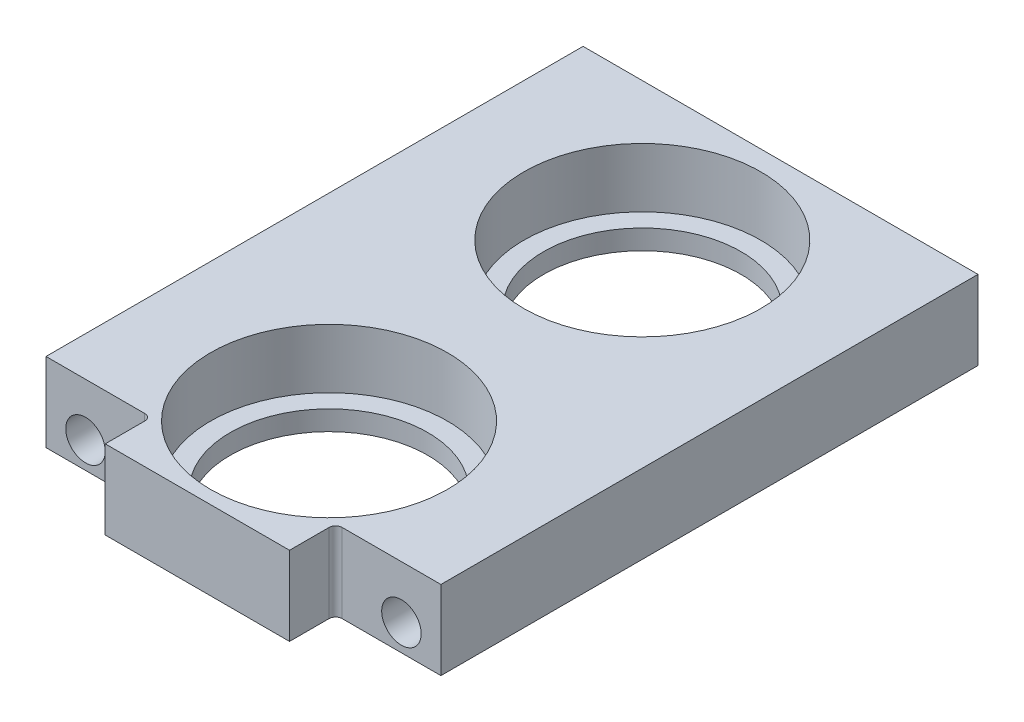
ISO-10303-21;
HEADER;
FILE_DESCRIPTION(('STEP AP214'),'2;1');
FILE_NAME('part.step','',(''),(''),'','','');
FILE_SCHEMA(('AUTOMOTIVE_DESIGN { 1 0 10303 214 1 1 1 1 }'));
ENDSEC;
DATA;
#1=APPLICATION_CONTEXT('core data for automotive mechanical design processes');
#2=APPLICATION_PROTOCOL_DEFINITION('international standard','automotive_design',2000,#1);
#3=PRODUCT_CONTEXT('',#1,'mechanical');
#4=PRODUCT('Part','Part','',(#3));
#5=PRODUCT_RELATED_PRODUCT_CATEGORY('part','',(#4));
#6=PRODUCT_DEFINITION_FORMATION('','',#4);
#7=PRODUCT_DEFINITION_CONTEXT('part definition',#1,'design');
#8=PRODUCT_DEFINITION('design','',#6,#7);
#9=PRODUCT_DEFINITION_SHAPE('','',#8);
#10=(LENGTH_UNIT() NAMED_UNIT(*) SI_UNIT(.MILLI.,.METRE.));
#11=(NAMED_UNIT(*) PLANE_ANGLE_UNIT() SI_UNIT($,.RADIAN.));
#12=(NAMED_UNIT(*) SI_UNIT($,.STERADIAN.) SOLID_ANGLE_UNIT());
#13=UNCERTAINTY_MEASURE_WITH_UNIT(LENGTH_MEASURE(1.E-05),#10,'distance_accuracy_value','');
#14=(GEOMETRIC_REPRESENTATION_CONTEXT(3) GLOBAL_UNCERTAINTY_ASSIGNED_CONTEXT((#13)) GLOBAL_UNIT_ASSIGNED_CONTEXT((#10,
#11,#12)) REPRESENTATION_CONTEXT('',''));
#15=CARTESIAN_POINT('',(0.,0.,0.));
#16=DIRECTION('',(0.,0.,1.));
#17=DIRECTION('',(1.,0.,0.));
#18=AXIS2_PLACEMENT_3D('',#15,#16,#17);
#19=CARTESIAN_POINT('',(15.,6.,-22.15));
#20=DIRECTION('',(-1.,0.,0.));
#21=DIRECTION('',(0.,0.,1.));
#22=AXIS2_PLACEMENT_3D('',#19,#20,#21);
#23=PLANE('',#22);
#24=DIRECTION('',(0.,0.,-1.));
#25=VECTOR('',#24,1.);
#26=CARTESIAN_POINT('',(15.,6.,-22.15));
#27=LINE('',#26,#25);
#28=CARTESIAN_POINT('',(15.,6.,18.65));
#29=VERTEX_POINT('',#28);
#30=CARTESIAN_POINT('',(15.,6.,-22.15));
#31=VERTEX_POINT('',#30);
#32=EDGE_CURVE('E156',#29,#31,#27,.T.);
#33=ORIENTED_EDGE('',*,*,#32,.F.);
#34=DIRECTION('',(0.,1.,0.));
#35=VECTOR('',#34,1.);
#36=CARTESIAN_POINT('',(15.,-4.,18.65));
#37=LINE('',#36,#35);
#38=CARTESIAN_POINT('',(15.,0.,18.65));
#39=VERTEX_POINT('',#38);
#40=EDGE_CURVE('E300',#39,#29,#37,.T.);
#41=ORIENTED_EDGE('',*,*,#40,.F.);
#42=DIRECTION('',(0.,0.,-1.));
#43=VECTOR('',#42,1.);
#44=CARTESIAN_POINT('',(15.,0.,-22.15));
#45=LINE('',#44,#43);
#46=CARTESIAN_POINT('',(15.,0.,-22.15));
#47=VERTEX_POINT('',#46);
#48=EDGE_CURVE('E147',#39,#47,#45,.T.);
#49=ORIENTED_EDGE('',*,*,#48,.T.);
#50=DIRECTION('',(0.,-1.,0.));
#51=VECTOR('',#50,1.);
#52=CARTESIAN_POINT('',(15.,6.,-22.15));
#53=LINE('',#52,#51);
#54=EDGE_CURVE('E140',#31,#47,#53,.T.);
#55=ORIENTED_EDGE('',*,*,#54,.F.);
#56=EDGE_LOOP('',(#33,#41,#49,#55));
#57=FACE_BOUND('',#56,.T.);
#58=ADVANCED_FACE('F35',(#57),#23,.F.);
#59=CARTESIAN_POINT('',(-15.,6.,-22.15));
#60=DIRECTION('',(0.,0.,1.));
#61=DIRECTION('',(1.,0.,0.));
#62=AXIS2_PLACEMENT_3D('',#59,#60,#61);
#63=PLANE('',#62);
#64=DIRECTION('',(-1.,0.,0.));
#65=VECTOR('',#64,1.);
#66=CARTESIAN_POINT('',(-15.,0.,-22.15));
#67=LINE('',#66,#65);
#68=CARTESIAN_POINT('',(-15.,0.,-22.15));
#69=VERTEX_POINT('',#68);
#70=EDGE_CURVE('E149',#47,#69,#67,.T.);
#71=ORIENTED_EDGE('',*,*,#70,.T.);
#72=DIRECTION('',(0.,-1.,0.));
#73=VECTOR('',#72,1.);
#74=CARTESIAN_POINT('',(-15.,6.,-22.15));
#75=LINE('',#74,#73);
#76=CARTESIAN_POINT('',(-15.,6.,-22.15));
#77=VERTEX_POINT('',#76);
#78=EDGE_CURVE('E136',#77,#69,#75,.T.);
#79=ORIENTED_EDGE('',*,*,#78,.F.);
#80=DIRECTION('',(-1.,0.,0.));
#81=VECTOR('',#80,1.);
#82=CARTESIAN_POINT('',(-15.,6.,-22.15));
#83=LINE('',#82,#81);
#84=EDGE_CURVE('E143',#31,#77,#83,.T.);
#85=ORIENTED_EDGE('',*,*,#84,.F.);
#86=ORIENTED_EDGE('',*,*,#54,.T.);
#87=EDGE_LOOP('',(#71,#79,#85,#86));
#88=FACE_BOUND('',#87,.T.);
#89=ADVANCED_FACE('F208',(#88),#63,.F.);
#90=CARTESIAN_POINT('',(-15.,6.,-22.15));
#91=DIRECTION('',(1.,0.,0.));
#92=DIRECTION('',(0.,0.,-1.));
#93=AXIS2_PLACEMENT_3D('',#90,#91,#92);
#94=PLANE('',#93);
#95=DIRECTION('',(0.,0.,1.));
#96=VECTOR('',#95,1.);
#97=CARTESIAN_POINT('',(-15.,0.,-22.15));
#98=LINE('',#97,#96);
#99=CARTESIAN_POINT('',(-15.,0.,18.65));
#100=VERTEX_POINT('',#99);
#101=EDGE_CURVE('E152',#69,#100,#98,.T.);
#102=ORIENTED_EDGE('',*,*,#101,.T.);
#103=DIRECTION('',(0.,1.,0.));
#104=VECTOR('',#103,1.);
#105=CARTESIAN_POINT('',(-15.,-4.,18.65));
#106=LINE('',#105,#104);
#107=CARTESIAN_POINT('',(-15.,6.,18.65));
#108=VERTEX_POINT('',#107);
#109=EDGE_CURVE('E122',#100,#108,#106,.T.);
#110=ORIENTED_EDGE('',*,*,#109,.T.);
#111=DIRECTION('',(0.,0.,1.));
#112=VECTOR('',#111,1.);
#113=CARTESIAN_POINT('',(-15.,6.,-22.15));
#114=LINE('',#113,#112);
#115=EDGE_CURVE('E137',#77,#108,#114,.T.);
#116=ORIENTED_EDGE('',*,*,#115,.F.);
#117=ORIENTED_EDGE('',*,*,#78,.T.);
#118=EDGE_LOOP('',(#102,#110,#116,#117));
#119=FACE_BOUND('',#118,.T.);
#120=ADVANCED_FACE('F213',(#119),#94,.F.);
#121=CARTESIAN_POINT('',(-15.,6.,22.15));
#122=DIRECTION('',(0.,0.,-1.));
#123=DIRECTION('',(-1.,0.,0.));
#124=AXIS2_PLACEMENT_3D('',#121,#122,#123);
#125=PLANE('',#124);
#126=DIRECTION('',(1.,0.,0.));
#127=VECTOR('',#126,1.);
#128=CARTESIAN_POINT('',(-15.,6.,22.15));
#129=LINE('',#128,#127);
#130=CARTESIAN_POINT('',(-7.,6.,22.15));
#131=VERTEX_POINT('',#130);
#132=CARTESIAN_POINT('',(7.,6.,22.15));
#133=VERTEX_POINT('',#132);
#134=EDGE_CURVE('E129',#131,#133,#129,.T.);
#135=ORIENTED_EDGE('',*,*,#134,.F.);
#136=DIRECTION('',(0.,1.,0.));
#137=VECTOR('',#136,1.);
#138=CARTESIAN_POINT('',(-7.,-4.,22.15));
#139=LINE('',#138,#137);
#140=CARTESIAN_POINT('',(-7.,0.,22.15));
#141=VERTEX_POINT('',#140);
#142=EDGE_CURVE('E111',#141,#131,#139,.T.);
#143=ORIENTED_EDGE('',*,*,#142,.F.);
#144=DIRECTION('',(1.,0.,0.));
#145=VECTOR('',#144,1.);
#146=CARTESIAN_POINT('',(-15.,0.,22.15));
#147=LINE('',#146,#145);
#148=CARTESIAN_POINT('',(7.,0.,22.15));
#149=VERTEX_POINT('',#148);
#150=EDGE_CURVE('E155',#141,#149,#147,.T.);
#151=ORIENTED_EDGE('',*,*,#150,.T.);
#152=DIRECTION('',(0.,1.,0.));
#153=VECTOR('',#152,1.);
#154=CARTESIAN_POINT('',(7.,-4.,22.15));
#155=LINE('',#154,#153);
#156=EDGE_CURVE('E131',#149,#133,#155,.T.);
#157=ORIENTED_EDGE('',*,*,#156,.T.);
#158=EDGE_LOOP('',(#135,#143,#151,#157));
#159=FACE_BOUND('',#158,.T.);
#160=ADVANCED_FACE('F134',(#159),#125,.F.);
#161=CARTESIAN_POINT('',(0.,6.,0.));
#162=DIRECTION('',(0.,1.,0.));
#163=DIRECTION('',(0.,0.,1.));
#164=AXIS2_PLACEMENT_3D('',#161,#162,#163);
#165=PLANE('',#164);
#166=DIRECTION('',(-1.,0.,0.));
#167=VECTOR('',#166,1.);
#168=CARTESIAN_POINT('',(-6.99999999999999,6.,18.65));
#169=LINE('',#168,#167);
#170=CARTESIAN_POINT('',(-7.49999999999999,6.,18.65));
#171=VERTEX_POINT('',#170);
#172=EDGE_CURVE('E123',#171,#108,#169,.T.);
#173=ORIENTED_EDGE('',*,*,#172,.F.);
#174=CARTESIAN_POINT('',(-7.49999999999999,6.,19.15));
#175=DIRECTION('',(0.,1.,0.));
#176=DIRECTION('',(0.,0.,1.));
#177=AXIS2_PLACEMENT_3D('',#174,#175,#176);
#178=CIRCLE('',#177,0.5);
#179=CARTESIAN_POINT('',(-6.99999999999999,6.,19.15));
#180=VERTEX_POINT('',#179);
#181=EDGE_CURVE('E130',#171,#180,#178,.F.);
#182=ORIENTED_EDGE('',*,*,#181,.T.);
#183=DIRECTION('',(0.,0.,-1.));
#184=VECTOR('',#183,1.);
#185=CARTESIAN_POINT('',(-7.,6.,22.15));
#186=LINE('',#185,#184);
#187=EDGE_CURVE('E114',#131,#180,#186,.T.);
#188=ORIENTED_EDGE('',*,*,#187,.F.);
#189=ORIENTED_EDGE('',*,*,#134,.T.);
#190=DIRECTION('',(0.,0.,1.));
#191=VECTOR('',#190,1.);
#192=CARTESIAN_POINT('',(7.,6.,22.15));
#193=LINE('',#192,#191);
#194=CARTESIAN_POINT('',(7.,6.,19.15));
#195=VERTEX_POINT('',#194);
#196=EDGE_CURVE('E285',#195,#133,#193,.T.);
#197=ORIENTED_EDGE('',*,*,#196,.F.);
#198=CARTESIAN_POINT('',(7.5,6.,19.15));
#199=DIRECTION('',(0.,1.,0.));
#200=DIRECTION('',(0.,0.,1.));
#201=AXIS2_PLACEMENT_3D('',#198,#199,#200);
#202=CIRCLE('',#201,0.5);
#203=CARTESIAN_POINT('',(7.5,6.,18.65));
#204=VERTEX_POINT('',#203);
#205=EDGE_CURVE('E43',#195,#204,#202,.F.);
#206=ORIENTED_EDGE('',*,*,#205,.T.);
#207=DIRECTION('',(-1.,0.,0.));
#208=VECTOR('',#207,1.);
#209=CARTESIAN_POINT('',(7.,6.,18.65));
#210=LINE('',#209,#208);
#211=EDGE_CURVE('E282',#29,#204,#210,.T.);
#212=ORIENTED_EDGE('',*,*,#211,.F.);
#213=ORIENTED_EDGE('',*,*,#32,.T.);
#214=ORIENTED_EDGE('',*,*,#84,.T.);
#215=ORIENTED_EDGE('',*,*,#115,.T.);
#216=EDGE_LOOP('',(#173,#182,#188,#189,#197,#206,#212,#213,#214,#215));
#217=FACE_BOUND('',#216,.T.);
#218=CARTESIAN_POINT('',(0.,6.,-11.65));
#219=DIRECTION('',(0.,1.,0.));
#220=DIRECTION('',(0.,0.,1.));
#221=AXIS2_PLACEMENT_3D('',#218,#219,#220);
#222=CIRCLE('',#221,9.);
#223=CARTESIAN_POINT('',(0.,6.,-2.65));
#224=VERTEX_POINT('',#223);
#225=EDGE_CURVE('E309',#224,#224,#222,.T.);
#226=ORIENTED_EDGE('',*,*,#225,.F.);
#227=EDGE_LOOP('',(#226));
#228=FACE_BOUND('',#227,.T.);
#229=CARTESIAN_POINT('',(0.,6.,12.15));
#230=DIRECTION('',(0.,1.,0.));
#231=DIRECTION('',(0.,0.,1.));
#232=AXIS2_PLACEMENT_3D('',#229,#230,#231);
#233=CIRCLE('',#232,9.);
#234=CARTESIAN_POINT('',(0.,6.,21.15));
#235=VERTEX_POINT('',#234);
#236=EDGE_CURVE('E168',#235,#235,#233,.T.);
#237=ORIENTED_EDGE('',*,*,#236,.F.);
#238=EDGE_LOOP('',(#237));
#239=FACE_BOUND('',#238,.T.);
#240=ADVANCED_FACE('F127',(#217,#228,#239),#165,.T.);
#241=CARTESIAN_POINT('',(0.,0.,0.));
#242=DIRECTION('',(0.,1.,0.));
#243=DIRECTION('',(0.,0.,1.));
#244=AXIS2_PLACEMENT_3D('',#241,#242,#243);
#245=PLANE('',#244);
#246=CARTESIAN_POINT('',(0.,0.,-11.65));
#247=DIRECTION('',(0.,1.,0.));
#248=DIRECTION('',(0.,0.,1.));
#249=AXIS2_PLACEMENT_3D('',#246,#247,#248);
#250=CIRCLE('',#249,7.5);
#251=CARTESIAN_POINT('',(0.,0.,-4.15));
#252=VERTEX_POINT('',#251);
#253=EDGE_CURVE('E164',#252,#252,#250,.T.);
#254=ORIENTED_EDGE('',*,*,#253,.T.);
#255=EDGE_LOOP('',(#254));
#256=FACE_BOUND('',#255,.T.);
#257=CARTESIAN_POINT('',(0.,0.,12.15));
#258=DIRECTION('',(0.,1.,0.));
#259=DIRECTION('',(0.,0.,1.));
#260=AXIS2_PLACEMENT_3D('',#257,#258,#259);
#261=CIRCLE('',#260,7.5);
#262=CARTESIAN_POINT('',(0.,0.,19.65));
#263=VERTEX_POINT('',#262);
#264=EDGE_CURVE('E161',#263,#263,#261,.T.);
#265=ORIENTED_EDGE('',*,*,#264,.T.);
#266=EDGE_LOOP('',(#265));
#267=FACE_BOUND('',#266,.T.);
#268=DIRECTION('',(0.,0.,-1.));
#269=VECTOR('',#268,1.);
#270=CARTESIAN_POINT('',(-6.99999999999994,0.,0.));
#271=LINE('',#270,#269);
#272=CARTESIAN_POINT('',(-6.99999999999999,0.,19.15));
#273=VERTEX_POINT('',#272);
#274=EDGE_CURVE('E117',#141,#273,#271,.T.);
#275=ORIENTED_EDGE('',*,*,#274,.T.);
#276=CARTESIAN_POINT('',(-7.49999999999999,0.,19.15));
#277=DIRECTION('',(0.,1.,0.));
#278=DIRECTION('',(0.,0.,1.));
#279=AXIS2_PLACEMENT_3D('',#276,#277,#278);
#280=CIRCLE('',#279,0.5);
#281=CARTESIAN_POINT('',(-7.49999999999999,0.,18.65));
#282=VERTEX_POINT('',#281);
#283=EDGE_CURVE('E185',#273,#282,#280,.T.);
#284=ORIENTED_EDGE('',*,*,#283,.T.);
#285=DIRECTION('',(-1.,0.,0.));
#286=VECTOR('',#285,1.);
#287=CARTESIAN_POINT('',(0.,0.,18.65));
#288=LINE('',#287,#286);
#289=EDGE_CURVE('E173',#282,#100,#288,.T.);
#290=ORIENTED_EDGE('',*,*,#289,.T.);
#291=ORIENTED_EDGE('',*,*,#101,.F.);
#292=ORIENTED_EDGE('',*,*,#70,.F.);
#293=ORIENTED_EDGE('',*,*,#48,.F.);
#294=DIRECTION('',(-1.,0.,0.));
#295=VECTOR('',#294,1.);
#296=CARTESIAN_POINT('',(0.,0.,18.65));
#297=LINE('',#296,#295);
#298=CARTESIAN_POINT('',(7.5,0.,18.65));
#299=VERTEX_POINT('',#298);
#300=EDGE_CURVE('E160',#39,#299,#297,.T.);
#301=ORIENTED_EDGE('',*,*,#300,.T.);
#302=CARTESIAN_POINT('',(7.5,0.,19.15));
#303=DIRECTION('',(0.,1.,0.));
#304=DIRECTION('',(0.,0.,1.));
#305=AXIS2_PLACEMENT_3D('',#302,#303,#304);
#306=CIRCLE('',#305,0.5);
#307=CARTESIAN_POINT('',(7.,0.,19.15));
#308=VERTEX_POINT('',#307);
#309=EDGE_CURVE('E11',#299,#308,#306,.T.);
#310=ORIENTED_EDGE('',*,*,#309,.T.);
#311=DIRECTION('',(0.,0.,1.));
#312=VECTOR('',#311,1.);
#313=CARTESIAN_POINT('',(7.,0.,0.));
#314=LINE('',#313,#312);
#315=EDGE_CURVE('E170',#308,#149,#314,.T.);
#316=ORIENTED_EDGE('',*,*,#315,.T.);
#317=ORIENTED_EDGE('',*,*,#150,.F.);
#318=EDGE_LOOP('',(#275,#284,#290,#291,#292,#293,#301,#310,#316,#317));
#319=FACE_BOUND('',#318,.T.);
#320=ADVANCED_FACE('F189',(#256,#267,#319),#245,.F.);
#321=CARTESIAN_POINT('',(0.,1.5,12.15));
#322=DIRECTION('',(0.,1.,0.));
#323=DIRECTION('',(0.,0.,1.));
#324=AXIS2_PLACEMENT_3D('',#321,#322,#323);
#325=CYLINDRICAL_SURFACE('',#324,9.);
#326=CARTESIAN_POINT('',(0.,1.5,12.15));
#327=DIRECTION('',(0.,1.,0.));
#328=DIRECTION('',(0.,0.,1.));
#329=AXIS2_PLACEMENT_3D('',#326,#327,#328);
#330=CIRCLE('',#329,9.);
#331=CARTESIAN_POINT('',(0.,1.5,21.15));
#332=VERTEX_POINT('',#331);
#333=EDGE_CURVE('E312',#332,#332,#330,.T.);
#334=ORIENTED_EDGE('',*,*,#333,.F.);
#335=EDGE_LOOP('',(#334));
#336=FACE_BOUND('',#335,.T.);
#337=ORIENTED_EDGE('',*,*,#236,.T.);
#338=EDGE_LOOP('',(#337));
#339=FACE_BOUND('',#338,.T.);
#340=ADVANCED_FACE('F225',(#336,#339),#325,.F.);
#341=CARTESIAN_POINT('',(0.,1.5,12.15));
#342=DIRECTION('',(0.,1.,0.));
#343=DIRECTION('',(0.,0.,1.));
#344=AXIS2_PLACEMENT_3D('',#341,#342,#343);
#345=PLANE('',#344);
#346=CARTESIAN_POINT('',(0.,1.5,12.15));
#347=DIRECTION('',(0.,1.,0.));
#348=DIRECTION('',(0.,0.,1.));
#349=AXIS2_PLACEMENT_3D('',#346,#347,#348);
#350=CIRCLE('',#349,7.5);
#351=CARTESIAN_POINT('',(0.,1.5,19.65));
#352=VERTEX_POINT('',#351);
#353=EDGE_CURVE('E297',#352,#352,#350,.T.);
#354=ORIENTED_EDGE('',*,*,#353,.F.);
#355=EDGE_LOOP('',(#354));
#356=FACE_BOUND('',#355,.T.);
#357=ORIENTED_EDGE('',*,*,#333,.T.);
#358=EDGE_LOOP('',(#357));
#359=FACE_BOUND('',#358,.T.);
#360=ADVANCED_FACE('F231',(#356,#359),#345,.T.);
#361=CARTESIAN_POINT('',(0.,1.5,-11.65));
#362=DIRECTION('',(0.,1.,0.));
#363=DIRECTION('',(0.,0.,1.));
#364=AXIS2_PLACEMENT_3D('',#361,#362,#363);
#365=CYLINDRICAL_SURFACE('',#364,9.);
#366=CARTESIAN_POINT('',(0.,1.5,-11.65));
#367=DIRECTION('',(0.,1.,0.));
#368=DIRECTION('',(0.,0.,1.));
#369=AXIS2_PLACEMENT_3D('',#366,#367,#368);
#370=CIRCLE('',#369,9.);
#371=CARTESIAN_POINT('',(0.,1.5,-2.65));
#372=VERTEX_POINT('',#371);
#373=EDGE_CURVE('E150',#372,#372,#370,.T.);
#374=ORIENTED_EDGE('',*,*,#373,.F.);
#375=EDGE_LOOP('',(#374));
#376=FACE_BOUND('',#375,.T.);
#377=ORIENTED_EDGE('',*,*,#225,.T.);
#378=EDGE_LOOP('',(#377));
#379=FACE_BOUND('',#378,.T.);
#380=ADVANCED_FACE('F235',(#376,#379),#365,.F.);
#381=CARTESIAN_POINT('',(0.,1.5,-11.65));
#382=DIRECTION('',(0.,1.,0.));
#383=DIRECTION('',(0.,0.,1.));
#384=AXIS2_PLACEMENT_3D('',#381,#382,#383);
#385=PLANE('',#384);
#386=CARTESIAN_POINT('',(0.,1.5,-11.65));
#387=DIRECTION('',(0.,1.,0.));
#388=DIRECTION('',(0.,0.,1.));
#389=AXIS2_PLACEMENT_3D('',#386,#387,#388);
#390=CIRCLE('',#389,7.5);
#391=CARTESIAN_POINT('',(0.,1.5,-4.15));
#392=VERTEX_POINT('',#391);
#393=EDGE_CURVE('E165',#392,#392,#390,.T.);
#394=ORIENTED_EDGE('',*,*,#393,.F.);
#395=EDGE_LOOP('',(#394));
#396=FACE_BOUND('',#395,.T.);
#397=ORIENTED_EDGE('',*,*,#373,.T.);
#398=EDGE_LOOP('',(#397));
#399=FACE_BOUND('',#398,.T.);
#400=ADVANCED_FACE('F239',(#396,#399),#385,.T.);
#401=CARTESIAN_POINT('',(0.,-3.,12.15));
#402=DIRECTION('',(0.,1.,0.));
#403=DIRECTION('',(0.,0.,1.));
#404=AXIS2_PLACEMENT_3D('',#401,#402,#403);
#405=CYLINDRICAL_SURFACE('',#404,7.5);
#406=ORIENTED_EDGE('',*,*,#353,.T.);
#407=EDGE_LOOP('',(#406));
#408=FACE_BOUND('',#407,.T.);
#409=ORIENTED_EDGE('',*,*,#264,.F.);
#410=EDGE_LOOP('',(#409));
#411=FACE_BOUND('',#410,.T.);
#412=ADVANCED_FACE('F243',(#408,#411),#405,.F.);
#413=CARTESIAN_POINT('',(0.,-3.,-11.65));
#414=DIRECTION('',(0.,1.,0.));
#415=DIRECTION('',(0.,0.,1.));
#416=AXIS2_PLACEMENT_3D('',#413,#414,#415);
#417=CYLINDRICAL_SURFACE('',#416,7.5);
#418=ORIENTED_EDGE('',*,*,#393,.T.);
#419=EDGE_LOOP('',(#418));
#420=FACE_BOUND('',#419,.T.);
#421=ORIENTED_EDGE('',*,*,#253,.F.);
#422=EDGE_LOOP('',(#421));
#423=FACE_BOUND('',#422,.T.);
#424=ADVANCED_FACE('F247',(#420,#423),#417,.F.);
#425=CARTESIAN_POINT('',(7.,-4.,22.15));
#426=DIRECTION('',(-1.,0.,0.));
#427=DIRECTION('',(0.,0.,1.));
#428=AXIS2_PLACEMENT_3D('',#425,#426,#427);
#429=PLANE('',#428);
#430=ORIENTED_EDGE('',*,*,#315,.F.);
#431=DIRECTION('',(0.,1.,0.));
#432=VECTOR('',#431,1.);
#433=CARTESIAN_POINT('',(7.,6.,19.15));
#434=LINE('',#433,#432);
#435=EDGE_CURVE('E180',#308,#195,#434,.T.);
#436=ORIENTED_EDGE('',*,*,#435,.T.);
#437=ORIENTED_EDGE('',*,*,#196,.T.);
#438=ORIENTED_EDGE('',*,*,#156,.F.);
#439=EDGE_LOOP('',(#430,#436,#437,#438));
#440=FACE_BOUND('',#439,.T.);
#441=ADVANCED_FACE('F251',(#440),#429,.F.);
#442=CARTESIAN_POINT('',(7.,-4.,18.65));
#443=DIRECTION('',(0.,0.,-1.));
#444=DIRECTION('',(-1.,0.,0.));
#445=AXIS2_PLACEMENT_3D('',#442,#443,#444);
#446=PLANE('',#445);
#447=CARTESIAN_POINT('',(12.,2.,18.65));
#448=DIRECTION('',(0.,0.,1.));
#449=DIRECTION('',(-1.,0.,0.));
#450=AXIS2_PLACEMENT_3D('',#447,#448,#449);
#451=CIRCLE('',#450,1.5);
#452=CARTESIAN_POINT('',(10.5,2.,18.65));
#453=VERTEX_POINT('',#452);
#454=EDGE_CURVE('E293',#453,#453,#451,.T.);
#455=ORIENTED_EDGE('',*,*,#454,.F.);
#456=EDGE_LOOP('',(#455));
#457=FACE_BOUND('',#456,.T.);
#458=ORIENTED_EDGE('',*,*,#211,.T.);
#459=DIRECTION('',(0.,1.,0.));
#460=VECTOR('',#459,1.);
#461=CARTESIAN_POINT('',(7.5,0.,18.65));
#462=LINE('',#461,#460);
#463=EDGE_CURVE('E50',#204,#299,#462,.F.);
#464=ORIENTED_EDGE('',*,*,#463,.T.);
#465=ORIENTED_EDGE('',*,*,#300,.F.);
#466=ORIENTED_EDGE('',*,*,#40,.T.);
#467=EDGE_LOOP('',(#458,#464,#465,#466));
#468=FACE_BOUND('',#467,.T.);
#469=ADVANCED_FACE('F253',(#457,#468),#446,.F.);
#470=CARTESIAN_POINT('',(-6.99999999999999,-4.,18.65));
#471=DIRECTION('',(0.,0.,-1.));
#472=DIRECTION('',(-1.,0.,0.));
#473=AXIS2_PLACEMENT_3D('',#470,#471,#472);
#474=PLANE('',#473);
#475=CARTESIAN_POINT('',(-12.,2.,18.65));
#476=DIRECTION('',(0.,0.,1.));
#477=DIRECTION('',(1.,0.,0.));
#478=AXIS2_PLACEMENT_3D('',#475,#476,#477);
#479=CIRCLE('',#478,1.5);
#480=CARTESIAN_POINT('',(-10.5,2.,18.65));
#481=VERTEX_POINT('',#480);
#482=EDGE_CURVE('E283',#481,#481,#479,.T.);
#483=ORIENTED_EDGE('',*,*,#482,.F.);
#484=EDGE_LOOP('',(#483));
#485=FACE_BOUND('',#484,.T.);
#486=ORIENTED_EDGE('',*,*,#289,.F.);
#487=DIRECTION('',(0.,1.,0.));
#488=VECTOR('',#487,1.);
#489=CARTESIAN_POINT('',(-7.49999999999999,6.,18.65));
#490=LINE('',#489,#488);
#491=EDGE_CURVE('E175',#282,#171,#490,.T.);
#492=ORIENTED_EDGE('',*,*,#491,.T.);
#493=ORIENTED_EDGE('',*,*,#172,.T.);
#494=ORIENTED_EDGE('',*,*,#109,.F.);
#495=EDGE_LOOP('',(#486,#492,#493,#494));
#496=FACE_BOUND('',#495,.T.);
#497=ADVANCED_FACE('F195',(#485,#496),#474,.F.);
#498=CARTESIAN_POINT('',(-7.,-4.,22.15));
#499=DIRECTION('',(1.,0.,0.));
#500=DIRECTION('',(0.,0.,-1.));
#501=AXIS2_PLACEMENT_3D('',#498,#499,#500);
#502=PLANE('',#501);
#503=ORIENTED_EDGE('',*,*,#187,.T.);
#504=DIRECTION('',(0.,1.,0.));
#505=VECTOR('',#504,1.);
#506=CARTESIAN_POINT('',(-6.99999999999999,0.,19.15));
#507=LINE('',#506,#505);
#508=EDGE_CURVE('E178',#180,#273,#507,.F.);
#509=ORIENTED_EDGE('',*,*,#508,.T.);
#510=ORIENTED_EDGE('',*,*,#274,.F.);
#511=ORIENTED_EDGE('',*,*,#142,.T.);
#512=EDGE_LOOP('',(#503,#509,#510,#511));
#513=FACE_BOUND('',#512,.T.);
#514=ADVANCED_FACE('F113',(#513),#502,.F.);
#515=CARTESIAN_POINT('',(-7.49999999999999,-4.,19.15));
#516=DIRECTION('',(0.,-1.,0.));
#517=DIRECTION('',(0.,0.,-1.));
#518=AXIS2_PLACEMENT_3D('',#515,#516,#517);
#519=CYLINDRICAL_SURFACE('',#518,0.5);
#520=ORIENTED_EDGE('',*,*,#283,.F.);
#521=ORIENTED_EDGE('',*,*,#508,.F.);
#522=ORIENTED_EDGE('',*,*,#181,.F.);
#523=ORIENTED_EDGE('',*,*,#491,.F.);
#524=EDGE_LOOP('',(#520,#521,#522,#523));
#525=FACE_BOUND('',#524,.T.);
#526=ADVANCED_FACE('F197',(#525),#519,.F.);
#527=CARTESIAN_POINT('',(7.5,-4.,19.15));
#528=DIRECTION('',(0.,-1.,0.));
#529=DIRECTION('',(0.,0.,-1.));
#530=AXIS2_PLACEMENT_3D('',#527,#528,#529);
#531=CYLINDRICAL_SURFACE('',#530,0.5);
#532=ORIENTED_EDGE('',*,*,#309,.F.);
#533=ORIENTED_EDGE('',*,*,#463,.F.);
#534=ORIENTED_EDGE('',*,*,#205,.F.);
#535=ORIENTED_EDGE('',*,*,#435,.F.);
#536=EDGE_LOOP('',(#532,#533,#534,#535));
#537=FACE_BOUND('',#536,.T.);
#538=ADVANCED_FACE('F37',(#537),#531,.F.);
#539=CARTESIAN_POINT('',(-12.,2.,13.65));
#540=DIRECTION('',(0.,0.,1.));
#541=DIRECTION('',(1.,0.,0.));
#542=AXIS2_PLACEMENT_3D('',#539,#540,#541);
#543=CYLINDRICAL_SURFACE('',#542,1.5);
#544=CARTESIAN_POINT('',(-12.,2.,13.65));
#545=DIRECTION('',(0.,0.,1.));
#546=DIRECTION('',(1.,0.,0.));
#547=AXIS2_PLACEMENT_3D('',#544,#545,#546);
#548=CIRCLE('',#547,1.5);
#549=CARTESIAN_POINT('',(-10.5,2.,13.65));
#550=VERTEX_POINT('',#549);
#551=EDGE_CURVE('E281',#550,#550,#548,.T.);
#552=ORIENTED_EDGE('',*,*,#551,.F.);
#553=EDGE_LOOP('',(#552));
#554=FACE_BOUND('',#553,.T.);
#555=ORIENTED_EDGE('',*,*,#482,.T.);
#556=EDGE_LOOP('',(#555));
#557=FACE_BOUND('',#556,.T.);
#558=ADVANCED_FACE('F203',(#554,#557),#543,.F.);
#559=CARTESIAN_POINT('',(-12.,2.,13.65));
#560=DIRECTION('',(0.,0.,1.));
#561=DIRECTION('',(1.,0.,0.));
#562=AXIS2_PLACEMENT_3D('',#559,#560,#561);
#563=PLANE('',#562);
#564=ORIENTED_EDGE('',*,*,#551,.T.);
#565=EDGE_LOOP('',(#564));
#566=FACE_BOUND('',#565,.T.);
#567=ADVANCED_FACE('F267',(#566),#563,.T.);
#568=CARTESIAN_POINT('',(12.,2.,13.65));
#569=DIRECTION('',(0.,0.,1.));
#570=DIRECTION('',(1.,0.,0.));
#571=AXIS2_PLACEMENT_3D('',#568,#569,#570);
#572=CYLINDRICAL_SURFACE('',#571,1.5);
#573=CARTESIAN_POINT('',(12.,2.,13.65));
#574=DIRECTION('',(0.,0.,1.));
#575=DIRECTION('',(-1.,0.,0.));
#576=AXIS2_PLACEMENT_3D('',#573,#574,#575);
#577=CIRCLE('',#576,1.5);
#578=CARTESIAN_POINT('',(10.5,2.,13.65));
#579=VERTEX_POINT('',#578);
#580=EDGE_CURVE('E288',#579,#579,#577,.T.);
#581=ORIENTED_EDGE('',*,*,#580,.F.);
#582=EDGE_LOOP('',(#581));
#583=FACE_BOUND('',#582,.T.);
#584=ORIENTED_EDGE('',*,*,#454,.T.);
#585=EDGE_LOOP('',(#584));
#586=FACE_BOUND('',#585,.T.);
#587=ADVANCED_FACE('F263',(#583,#586),#572,.F.);
#588=CARTESIAN_POINT('',(12.,2.,13.65));
#589=DIRECTION('',(0.,0.,-1.));
#590=DIRECTION('',(-1.,0.,0.));
#591=AXIS2_PLACEMENT_3D('',#588,#589,#590);
#592=PLANE('',#591);
#593=ORIENTED_EDGE('',*,*,#580,.T.);
#594=EDGE_LOOP('',(#593));
#595=FACE_BOUND('',#594,.T.);
#596=ADVANCED_FACE('F266',(#595),#592,.F.);
#597=CLOSED_SHELL('',(#58,#89,#120,#160,#240,#320,#340,#360,#380,#400,#412,#424,#441,#469,#497,
#514,#526,#538,#558,#567,#587,#596));
#598=MANIFOLD_SOLID_BREP('B2',#597);
#599=ADVANCED_BREP_SHAPE_REPRESENTATION('',(#18,#598),#14);
#600=SHAPE_DEFINITION_REPRESENTATION(#9,#599);
ENDSEC;
END-ISO-10303-21;
